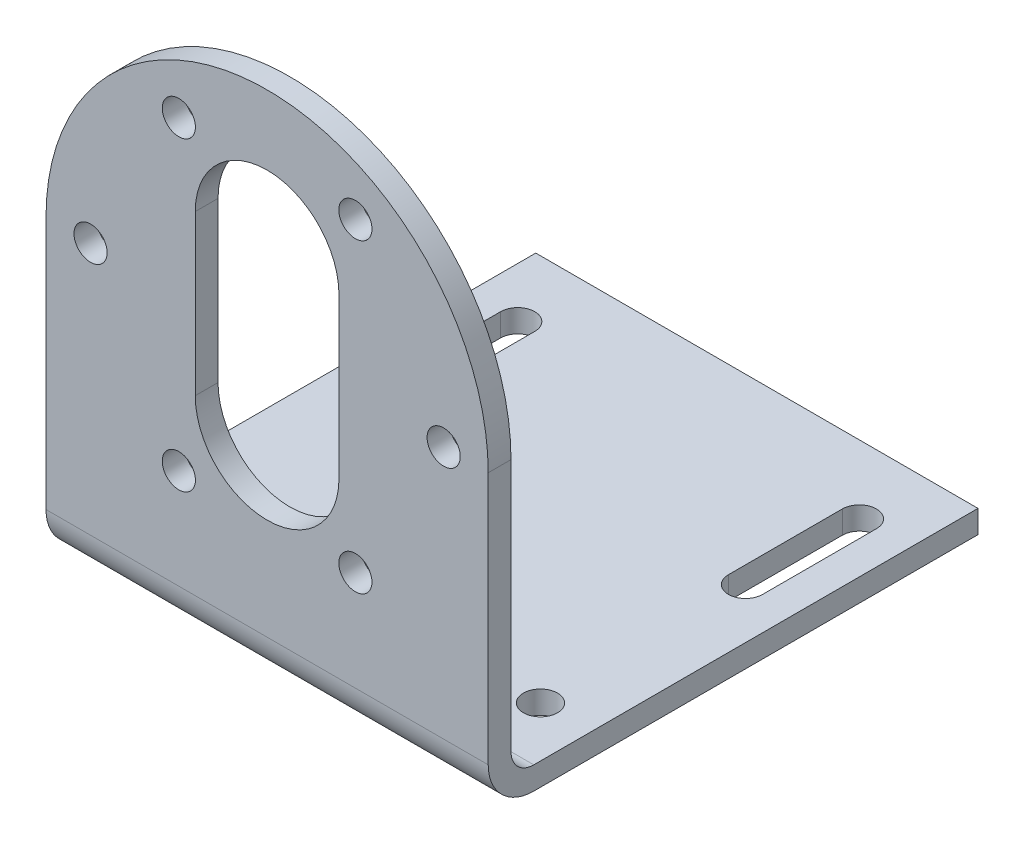
ISO-10303-21;
HEADER;
FILE_DESCRIPTION(('STEP AP214'),'2;1');
FILE_NAME('part.step','',(''),(''),'','','');
FILE_SCHEMA(('AUTOMOTIVE_DESIGN { 1 0 10303 214 1 1 1 1 }'));
ENDSEC;
DATA;
#1=APPLICATION_CONTEXT('core data for automotive mechanical design processes');
#2=APPLICATION_PROTOCOL_DEFINITION('international standard','automotive_design',2000,#1);
#3=PRODUCT_CONTEXT('',#1,'mechanical');
#4=PRODUCT('Part','Part','',(#3));
#5=PRODUCT_RELATED_PRODUCT_CATEGORY('part','',(#4));
#6=PRODUCT_DEFINITION_FORMATION('','',#4);
#7=PRODUCT_DEFINITION_CONTEXT('part definition',#1,'design');
#8=PRODUCT_DEFINITION('design','',#6,#7);
#9=PRODUCT_DEFINITION_SHAPE('','',#8);
#10=(LENGTH_UNIT() NAMED_UNIT(*) SI_UNIT(.MILLI.,.METRE.));
#11=(NAMED_UNIT(*) PLANE_ANGLE_UNIT() SI_UNIT($,.RADIAN.));
#12=(NAMED_UNIT(*) SI_UNIT($,.STERADIAN.) SOLID_ANGLE_UNIT());
#13=UNCERTAINTY_MEASURE_WITH_UNIT(LENGTH_MEASURE(1.E-05),#10,'distance_accuracy_value','');
#14=(GEOMETRIC_REPRESENTATION_CONTEXT(3) GLOBAL_UNCERTAINTY_ASSIGNED_CONTEXT((#13)) GLOBAL_UNIT_ASSIGNED_CONTEXT((#10,
#11,#12)) REPRESENTATION_CONTEXT('',''));
#15=CARTESIAN_POINT('',(0.,0.,0.));
#16=DIRECTION('',(0.,0.,1.));
#17=DIRECTION('',(1.,0.,0.));
#18=AXIS2_PLACEMENT_3D('',#15,#16,#17);
#19=CARTESIAN_POINT('',(0.,26.2069805339947,2.));
#20=DIRECTION('',(0.,0.,1.));
#21=DIRECTION('',(1.,0.,0.));
#22=AXIS2_PLACEMENT_3D('',#19,#20,#21);
#23=PLANE('',#22);
#24=DIRECTION('',(0.,-1.,0.));
#25=VECTOR('',#24,1.);
#26=CARTESIAN_POINT('',(-19.4125781733294,26.2069805339947,2.));
#27=LINE('',#26,#25);
#28=CARTESIAN_POINT('',(-19.4125781733294,26.2069805339947,2.));
#29=VERTEX_POINT('',#28);
#30=CARTESIAN_POINT('',(-19.4125781733294,4.00000000000001,2.));
#31=VERTEX_POINT('',#30);
#32=EDGE_CURVE('E342',#29,#31,#27,.T.);
#33=ORIENTED_EDGE('',*,*,#32,.T.);
#34=DIRECTION('',(1.,0.,0.));
#35=VECTOR('',#34,1.);
#36=CARTESIAN_POINT('',(19.4125781733294,4.,2.));
#37=LINE('',#36,#35);
#38=CARTESIAN_POINT('',(19.4125781733294,4.00000000000001,2.));
#39=VERTEX_POINT('',#38);
#40=EDGE_CURVE('E363',#31,#39,#37,.T.);
#41=ORIENTED_EDGE('',*,*,#40,.T.);
#42=DIRECTION('',(0.,1.,0.));
#43=VECTOR('',#42,1.);
#44=CARTESIAN_POINT('',(19.4125781733294,26.2069805339947,2.));
#45=LINE('',#44,#43);
#46=CARTESIAN_POINT('',(19.4125781733294,26.2069805339947,2.));
#47=VERTEX_POINT('',#46);
#48=EDGE_CURVE('E346',#39,#47,#45,.T.);
#49=ORIENTED_EDGE('',*,*,#48,.T.);
#50=CARTESIAN_POINT('',(0.,26.2069805339947,2.));
#51=DIRECTION('',(0.,0.,1.));
#52=DIRECTION('',(1.,0.,0.));
#53=AXIS2_PLACEMENT_3D('',#50,#51,#52);
#54=CIRCLE('',#53,19.4125781733294);
#55=EDGE_CURVE('E339',#47,#29,#54,.T.);
#56=ORIENTED_EDGE('',*,*,#55,.T.);
#57=EDGE_LOOP('',(#33,#41,#49,#56));
#58=FACE_BOUND('',#57,.T.);
#59=CARTESIAN_POINT('',(-7.75,39.6303742926535,2.));
#60=DIRECTION('',(0.,0.,1.));
#61=DIRECTION('',(1.,0.,0.));
#62=AXIS2_PLACEMENT_3D('',#59,#60,#61);
#63=CIRCLE('',#62,1.45594336299971);
#64=CARTESIAN_POINT('',(-6.2940566370003,39.6303742926535,2.));
#65=VERTEX_POINT('',#64);
#66=EDGE_CURVE('E309',#65,#65,#63,.T.);
#67=ORIENTED_EDGE('',*,*,#66,.F.);
#68=EDGE_LOOP('',(#67));
#69=FACE_BOUND('',#68,.T.);
#70=CARTESIAN_POINT('',(-7.75,12.7835867753359,2.));
#71=DIRECTION('',(0.,0.,1.));
#72=DIRECTION('',(1.,0.,0.));
#73=AXIS2_PLACEMENT_3D('',#70,#71,#72);
#74=CIRCLE('',#73,1.45594336299971);
#75=CARTESIAN_POINT('',(-6.29405663700029,12.7835867753359,2.));
#76=VERTEX_POINT('',#75);
#77=EDGE_CURVE('E321',#76,#76,#74,.T.);
#78=ORIENTED_EDGE('',*,*,#77,.F.);
#79=EDGE_LOOP('',(#78));
#80=FACE_BOUND('',#79,.T.);
#81=CARTESIAN_POINT('',(15.5,26.2069805339947,2.));
#82=DIRECTION('',(0.,0.,1.));
#83=DIRECTION('',(1.,0.,0.));
#84=AXIS2_PLACEMENT_3D('',#81,#82,#83);
#85=CIRCLE('',#84,1.4559433629997);
#86=CARTESIAN_POINT('',(16.9559433629997,26.2069805339947,2.));
#87=VERTEX_POINT('',#86);
#88=EDGE_CURVE('E333',#87,#87,#85,.T.);
#89=ORIENTED_EDGE('',*,*,#88,.F.);
#90=EDGE_LOOP('',(#89));
#91=FACE_BOUND('',#90,.T.);
#92=CARTESIAN_POINT('',(7.75,12.7835867753359,2.));
#93=DIRECTION('',(0.,0.,1.));
#94=DIRECTION('',(1.,0.,0.));
#95=AXIS2_PLACEMENT_3D('',#92,#93,#94);
#96=CIRCLE('',#95,1.45594336299971);
#97=CARTESIAN_POINT('',(9.2059433629997,12.7835867753359,2.));
#98=VERTEX_POINT('',#97);
#99=EDGE_CURVE('E327',#98,#98,#96,.T.);
#100=ORIENTED_EDGE('',*,*,#99,.F.);
#101=EDGE_LOOP('',(#100));
#102=FACE_BOUND('',#101,.T.);
#103=CARTESIAN_POINT('',(-15.5,26.2069805339947,2.));
#104=DIRECTION('',(0.,0.,1.));
#105=DIRECTION('',(1.,0.,0.));
#106=AXIS2_PLACEMENT_3D('',#103,#104,#105);
#107=CIRCLE('',#106,1.4559433629997);
#108=CARTESIAN_POINT('',(-14.0440566370003,26.2069805339947,2.));
#109=VERTEX_POINT('',#108);
#110=EDGE_CURVE('E315',#109,#109,#107,.T.);
#111=ORIENTED_EDGE('',*,*,#110,.F.);
#112=EDGE_LOOP('',(#111));
#113=FACE_BOUND('',#112,.T.);
#114=CARTESIAN_POINT('',(7.75,39.6303742926535,2.));
#115=DIRECTION('',(0.,0.,1.));
#116=DIRECTION('',(1.,0.,0.));
#117=AXIS2_PLACEMENT_3D('',#114,#115,#116);
#118=CIRCLE('',#117,1.4559433629997);
#119=CARTESIAN_POINT('',(9.2059433629997,39.6303742926535,2.));
#120=VERTEX_POINT('',#119);
#121=EDGE_CURVE('E303',#120,#120,#118,.T.);
#122=ORIENTED_EDGE('',*,*,#121,.F.);
#123=EDGE_LOOP('',(#122));
#124=FACE_BOUND('',#123,.T.);
#125=DIRECTION('',(0.,-1.,0.));
#126=VECTOR('',#125,1.);
#127=CARTESIAN_POINT('',(-6.30908790633205,33.2069805339947,2.));
#128=LINE('',#127,#126);
#129=CARTESIAN_POINT('',(-6.30908790633205,33.2069805339947,2.));
#130=VERTEX_POINT('',#129);
#131=CARTESIAN_POINT('',(-6.30908790633205,19.2069805339947,2.));
#132=VERTEX_POINT('',#131);
#133=EDGE_CURVE('E274',#130,#132,#128,.T.);
#134=ORIENTED_EDGE('',*,*,#133,.F.);
#135=CARTESIAN_POINT('',(0.,33.2069805339947,2.));
#136=DIRECTION('',(0.,0.,1.));
#137=DIRECTION('',(1.,0.,0.));
#138=AXIS2_PLACEMENT_3D('',#135,#136,#137);
#139=CIRCLE('',#138,6.30908790633205);
#140=CARTESIAN_POINT('',(6.30908790633205,33.2069805339947,2.));
#141=VERTEX_POINT('',#140);
#142=EDGE_CURVE('E272',#141,#130,#139,.T.);
#143=ORIENTED_EDGE('',*,*,#142,.F.);
#144=DIRECTION('',(0.,1.,0.));
#145=VECTOR('',#144,1.);
#146=CARTESIAN_POINT('',(6.30908790633205,33.2069805339947,2.));
#147=LINE('',#146,#145);
#148=CARTESIAN_POINT('',(6.30908790633205,19.2069805339947,2.));
#149=VERTEX_POINT('',#148);
#150=EDGE_CURVE('E280',#149,#141,#147,.T.);
#151=ORIENTED_EDGE('',*,*,#150,.F.);
#152=CARTESIAN_POINT('',(0.,19.2069805339947,2.));
#153=DIRECTION('',(0.,0.,1.));
#154=DIRECTION('',(1.,0.,0.));
#155=AXIS2_PLACEMENT_3D('',#152,#153,#154);
#156=CIRCLE('',#155,6.30908790633205);
#157=EDGE_CURVE('E277',#132,#149,#156,.T.);
#158=ORIENTED_EDGE('',*,*,#157,.F.);
#159=EDGE_LOOP('',(#134,#143,#151,#158));
#160=FACE_BOUND('',#159,.T.);
#161=ADVANCED_FACE('F34',(#58,#69,#80,#91,#102,#113,#124,#160),#23,.T.);
#162=CARTESIAN_POINT('',(0.,26.2069805339947,0.));
#163=DIRECTION('',(0.,0.,1.));
#164=DIRECTION('',(1.,0.,0.));
#165=AXIS2_PLACEMENT_3D('',#162,#163,#164);
#166=PLANE('',#165);
#167=CARTESIAN_POINT('',(7.75,39.6303742926535,0.));
#168=DIRECTION('',(0.,0.,1.));
#169=DIRECTION('',(1.,0.,0.));
#170=AXIS2_PLACEMENT_3D('',#167,#168,#169);
#171=CIRCLE('',#170,1.4559433629997);
#172=CARTESIAN_POINT('',(9.2059433629997,39.6303742926535,0.));
#173=VERTEX_POINT('',#172);
#174=EDGE_CURVE('E302',#173,#173,#171,.T.);
#175=ORIENTED_EDGE('',*,*,#174,.T.);
#176=EDGE_LOOP('',(#175));
#177=FACE_BOUND('',#176,.T.);
#178=CARTESIAN_POINT('',(-7.75,39.6303742926535,0.));
#179=DIRECTION('',(0.,0.,1.));
#180=DIRECTION('',(1.,0.,0.));
#181=AXIS2_PLACEMENT_3D('',#178,#179,#180);
#182=CIRCLE('',#181,1.45594336299971);
#183=CARTESIAN_POINT('',(-6.2940566370003,39.6303742926535,0.));
#184=VERTEX_POINT('',#183);
#185=EDGE_CURVE('E306',#184,#184,#182,.T.);
#186=ORIENTED_EDGE('',*,*,#185,.T.);
#187=EDGE_LOOP('',(#186));
#188=FACE_BOUND('',#187,.T.);
#189=CARTESIAN_POINT('',(-15.5,26.2069805339947,0.));
#190=DIRECTION('',(0.,0.,1.));
#191=DIRECTION('',(1.,0.,0.));
#192=AXIS2_PLACEMENT_3D('',#189,#190,#191);
#193=CIRCLE('',#192,1.4559433629997);
#194=CARTESIAN_POINT('',(-14.0440566370003,26.2069805339947,0.));
#195=VERTEX_POINT('',#194);
#196=EDGE_CURVE('E312',#195,#195,#193,.T.);
#197=ORIENTED_EDGE('',*,*,#196,.T.);
#198=EDGE_LOOP('',(#197));
#199=FACE_BOUND('',#198,.T.);
#200=CARTESIAN_POINT('',(-7.75,12.7835867753359,0.));
#201=DIRECTION('',(0.,0.,1.));
#202=DIRECTION('',(1.,0.,0.));
#203=AXIS2_PLACEMENT_3D('',#200,#201,#202);
#204=CIRCLE('',#203,1.45594336299971);
#205=CARTESIAN_POINT('',(-6.29405663700029,12.7835867753359,0.));
#206=VERTEX_POINT('',#205);
#207=EDGE_CURVE('E318',#206,#206,#204,.T.);
#208=ORIENTED_EDGE('',*,*,#207,.T.);
#209=EDGE_LOOP('',(#208));
#210=FACE_BOUND('',#209,.T.);
#211=CARTESIAN_POINT('',(7.75,12.7835867753359,0.));
#212=DIRECTION('',(0.,0.,1.));
#213=DIRECTION('',(1.,0.,0.));
#214=AXIS2_PLACEMENT_3D('',#211,#212,#213);
#215=CIRCLE('',#214,1.45594336299971);
#216=CARTESIAN_POINT('',(9.2059433629997,12.7835867753359,0.));
#217=VERTEX_POINT('',#216);
#218=EDGE_CURVE('E324',#217,#217,#215,.T.);
#219=ORIENTED_EDGE('',*,*,#218,.T.);
#220=EDGE_LOOP('',(#219));
#221=FACE_BOUND('',#220,.T.);
#222=CARTESIAN_POINT('',(15.5,26.2069805339947,0.));
#223=DIRECTION('',(0.,0.,1.));
#224=DIRECTION('',(1.,0.,0.));
#225=AXIS2_PLACEMENT_3D('',#222,#223,#224);
#226=CIRCLE('',#225,1.4559433629997);
#227=CARTESIAN_POINT('',(16.9559433629997,26.2069805339947,0.));
#228=VERTEX_POINT('',#227);
#229=EDGE_CURVE('E330',#228,#228,#226,.T.);
#230=ORIENTED_EDGE('',*,*,#229,.T.);
#231=EDGE_LOOP('',(#230));
#232=FACE_BOUND('',#231,.T.);
#233=DIRECTION('',(0.,1.,0.));
#234=VECTOR('',#233,1.);
#235=CARTESIAN_POINT('',(19.4125781733294,26.2069805339947,0.));
#236=LINE('',#235,#234);
#237=CARTESIAN_POINT('',(19.4125781733294,4.00000000000001,0.));
#238=VERTEX_POINT('',#237);
#239=CARTESIAN_POINT('',(19.4125781733294,26.2069805339947,0.));
#240=VERTEX_POINT('',#239);
#241=EDGE_CURVE('E343',#238,#240,#236,.T.);
#242=ORIENTED_EDGE('',*,*,#241,.F.);
#243=DIRECTION('',(-1.,0.,0.));
#244=VECTOR('',#243,1.);
#245=CARTESIAN_POINT('',(0.,4.,0.));
#246=LINE('',#245,#244);
#247=CARTESIAN_POINT('',(-19.4125781733294,4.00000000000001,0.));
#248=VERTEX_POINT('',#247);
#249=EDGE_CURVE('E372',#238,#248,#246,.T.);
#250=ORIENTED_EDGE('',*,*,#249,.T.);
#251=DIRECTION('',(0.,-1.,0.));
#252=VECTOR('',#251,1.);
#253=CARTESIAN_POINT('',(-19.4125781733294,26.2069805339947,0.));
#254=LINE('',#253,#252);
#255=CARTESIAN_POINT('',(-19.4125781733294,26.2069805339947,0.));
#256=VERTEX_POINT('',#255);
#257=EDGE_CURVE('E351',#256,#248,#254,.T.);
#258=ORIENTED_EDGE('',*,*,#257,.F.);
#259=CARTESIAN_POINT('',(0.,26.2069805339947,0.));
#260=DIRECTION('',(0.,0.,1.));
#261=DIRECTION('',(1.,0.,0.));
#262=AXIS2_PLACEMENT_3D('',#259,#260,#261);
#263=CIRCLE('',#262,19.4125781733294);
#264=EDGE_CURVE('E336',#240,#256,#263,.T.);
#265=ORIENTED_EDGE('',*,*,#264,.F.);
#266=EDGE_LOOP('',(#242,#250,#258,#265));
#267=FACE_BOUND('',#266,.T.);
#268=CARTESIAN_POINT('',(0.,33.2069805339947,0.));
#269=DIRECTION('',(0.,0.,1.));
#270=DIRECTION('',(1.,0.,0.));
#271=AXIS2_PLACEMENT_3D('',#268,#269,#270);
#272=CIRCLE('',#271,6.30908790633205);
#273=CARTESIAN_POINT('',(6.30908790633205,33.2069805339947,0.));
#274=VERTEX_POINT('',#273);
#275=CARTESIAN_POINT('',(-6.30908790633205,33.2069805339947,0.));
#276=VERTEX_POINT('',#275);
#277=EDGE_CURVE('E270',#274,#276,#272,.T.);
#278=ORIENTED_EDGE('',*,*,#277,.T.);
#279=DIRECTION('',(0.,-1.,0.));
#280=VECTOR('',#279,1.);
#281=CARTESIAN_POINT('',(-6.30908790633205,33.2069805339947,0.));
#282=LINE('',#281,#280);
#283=CARTESIAN_POINT('',(-6.30908790633205,19.2069805339947,0.));
#284=VERTEX_POINT('',#283);
#285=EDGE_CURVE('E285',#276,#284,#282,.T.);
#286=ORIENTED_EDGE('',*,*,#285,.T.);
#287=CARTESIAN_POINT('',(0.,19.2069805339947,0.));
#288=DIRECTION('',(0.,0.,1.));
#289=DIRECTION('',(1.,0.,0.));
#290=AXIS2_PLACEMENT_3D('',#287,#288,#289);
#291=CIRCLE('',#290,6.30908790633205);
#292=CARTESIAN_POINT('',(6.30908790633205,19.2069805339947,0.));
#293=VERTEX_POINT('',#292);
#294=EDGE_CURVE('E288',#284,#293,#291,.T.);
#295=ORIENTED_EDGE('',*,*,#294,.T.);
#296=DIRECTION('',(0.,1.,0.));
#297=VECTOR('',#296,1.);
#298=CARTESIAN_POINT('',(6.30908790633205,33.2069805339947,0.));
#299=LINE('',#298,#297);
#300=EDGE_CURVE('E275',#293,#274,#299,.T.);
#301=ORIENTED_EDGE('',*,*,#300,.T.);
#302=EDGE_LOOP('',(#278,#286,#295,#301));
#303=FACE_BOUND('',#302,.T.);
#304=ADVANCED_FACE('F378',(#177,#188,#199,#210,#221,#232,#267,#303),#166,.F.);
#305=CARTESIAN_POINT('',(0.,26.2069805339947,2.));
#306=DIRECTION('',(0.,0.,-1.));
#307=DIRECTION('',(-1.,0.,0.));
#308=AXIS2_PLACEMENT_3D('',#305,#306,#307);
#309=CYLINDRICAL_SURFACE('',#308,19.4125781733294);
#310=ORIENTED_EDGE('',*,*,#264,.T.);
#311=DIRECTION('',(0.,0.,-1.));
#312=VECTOR('',#311,1.);
#313=CARTESIAN_POINT('',(-19.4125781733294,26.2069805339947,2.));
#314=LINE('',#313,#312);
#315=EDGE_CURVE('E360',#29,#256,#314,.T.);
#316=ORIENTED_EDGE('',*,*,#315,.F.);
#317=ORIENTED_EDGE('',*,*,#55,.F.);
#318=DIRECTION('',(0.,0.,-1.));
#319=VECTOR('',#318,1.);
#320=CARTESIAN_POINT('',(19.4125781733294,26.2069805339947,2.));
#321=LINE('',#320,#319);
#322=EDGE_CURVE('E348',#47,#240,#321,.T.);
#323=ORIENTED_EDGE('',*,*,#322,.T.);
#324=EDGE_LOOP('',(#310,#316,#317,#323));
#325=FACE_BOUND('',#324,.T.);
#326=ADVANCED_FACE('F388',(#325),#309,.T.);
#327=CARTESIAN_POINT('',(-19.4125781733294,26.2069805339947,2.));
#328=DIRECTION('',(1.,0.,0.));
#329=DIRECTION('',(0.,0.,-1.));
#330=AXIS2_PLACEMENT_3D('',#327,#328,#329);
#331=PLANE('',#330);
#332=DIRECTION('',(0.,0.,-1.));
#333=VECTOR('',#332,1.);
#334=CARTESIAN_POINT('',(-19.4125781733294,0.,2.));
#335=LINE('',#334,#333);
#336=CARTESIAN_POINT('',(-19.4125781733294,0.,-2.));
#337=VERTEX_POINT('',#336);
#338=CARTESIAN_POINT('',(-19.4125781733294,0.,-41.));
#339=VERTEX_POINT('',#338);
#340=EDGE_CURVE('E358',#337,#339,#335,.T.);
#341=ORIENTED_EDGE('',*,*,#340,.F.);
#342=CARTESIAN_POINT('',(-19.4125781733294,4.,-2.));
#343=DIRECTION('',(1.,0.,0.));
#344=DIRECTION('',(0.,0.,-1.));
#345=AXIS2_PLACEMENT_3D('',#342,#343,#344);
#346=CIRCLE('',#345,4.);
#347=EDGE_CURVE('E370',#337,#31,#346,.F.);
#348=ORIENTED_EDGE('',*,*,#347,.T.);
#349=ORIENTED_EDGE('',*,*,#32,.F.);
#350=ORIENTED_EDGE('',*,*,#315,.T.);
#351=ORIENTED_EDGE('',*,*,#257,.T.);
#352=CARTESIAN_POINT('',(-19.4125781733294,4.,-2.));
#353=DIRECTION('',(1.,0.,0.));
#354=DIRECTION('',(0.,0.,-1.));
#355=AXIS2_PLACEMENT_3D('',#352,#353,#354);
#356=CIRCLE('',#355,2.);
#357=CARTESIAN_POINT('',(-19.4125781733294,2.,-2.));
#358=VERTEX_POINT('',#357);
#359=EDGE_CURVE('E42',#248,#358,#356,.T.);
#360=ORIENTED_EDGE('',*,*,#359,.T.);
#361=DIRECTION('',(0.,0.,1.));
#362=VECTOR('',#361,1.);
#363=CARTESIAN_POINT('',(-19.4125781733294,2.,-41.));
#364=LINE('',#363,#362);
#365=CARTESIAN_POINT('',(-19.4125781733294,2.,-41.));
#366=VERTEX_POINT('',#365);
#367=EDGE_CURVE('E268',#366,#358,#364,.T.);
#368=ORIENTED_EDGE('',*,*,#367,.F.);
#369=DIRECTION('',(0.,-1.,0.));
#370=VECTOR('',#369,1.);
#371=CARTESIAN_POINT('',(-19.4125781733294,0.,-41.));
#372=LINE('',#371,#370);
#373=EDGE_CURVE('E255',#366,#339,#372,.T.);
#374=ORIENTED_EDGE('',*,*,#373,.T.);
#375=EDGE_LOOP('',(#341,#348,#349,#350,#351,#360,#368,#374));
#376=FACE_BOUND('',#375,.T.);
#377=ADVANCED_FACE('F384',(#376),#331,.F.);
#378=CARTESIAN_POINT('',(-19.4125781733294,0.,2.));
#379=DIRECTION('',(0.,1.,0.));
#380=DIRECTION('',(0.,0.,1.));
#381=AXIS2_PLACEMENT_3D('',#378,#379,#380);
#382=PLANE('',#381);
#383=CARTESIAN_POINT('',(15.,0.,-7.));
#384=DIRECTION('',(0.,1.,0.));
#385=DIRECTION('',(0.,0.,1.));
#386=AXIS2_PLACEMENT_3D('',#383,#384,#385);
#387=CIRCLE('',#386,1.5);
#388=CARTESIAN_POINT('',(15.,0.,-5.5));
#389=VERTEX_POINT('',#388);
#390=EDGE_CURVE('E246',#389,#389,#387,.T.);
#391=ORIENTED_EDGE('',*,*,#390,.T.);
#392=EDGE_LOOP('',(#391));
#393=FACE_BOUND('',#392,.T.);
#394=DIRECTION('',(0.,0.,-1.));
#395=VECTOR('',#394,1.);
#396=CARTESIAN_POINT('',(-13.5,0.,1.99999999999999));
#397=LINE('',#396,#395);
#398=CARTESIAN_POINT('',(-13.5000000000001,0.,-25.));
#399=VERTEX_POINT('',#398);
#400=CARTESIAN_POINT('',(-13.5000000000001,0.,-35.));
#401=VERTEX_POINT('',#400);
#402=EDGE_CURVE('E240',#399,#401,#397,.T.);
#403=ORIENTED_EDGE('',*,*,#402,.T.);
#404=CARTESIAN_POINT('',(-15.0000000000001,0.,-35.));
#405=DIRECTION('',(0.,1.,0.));
#406=DIRECTION('',(0.,0.,1.));
#407=AXIS2_PLACEMENT_3D('',#404,#405,#406);
#408=CIRCLE('',#407,1.5);
#409=CARTESIAN_POINT('',(-16.5000000000001,0.,-35.));
#410=VERTEX_POINT('',#409);
#411=EDGE_CURVE('E243',#401,#410,#408,.T.);
#412=ORIENTED_EDGE('',*,*,#411,.T.);
#413=DIRECTION('',(0.,0.,1.));
#414=VECTOR('',#413,1.);
#415=CARTESIAN_POINT('',(-16.5,0.,2.));
#416=LINE('',#415,#414);
#417=CARTESIAN_POINT('',(-16.5000000000001,0.,-25.));
#418=VERTEX_POINT('',#417);
#419=EDGE_CURVE('E237',#410,#418,#416,.T.);
#420=ORIENTED_EDGE('',*,*,#419,.T.);
#421=CARTESIAN_POINT('',(-15.0000000000001,0.,-25.));
#422=DIRECTION('',(0.,1.,0.));
#423=DIRECTION('',(0.,0.,1.));
#424=AXIS2_PLACEMENT_3D('',#421,#422,#423);
#425=CIRCLE('',#424,1.5);
#426=EDGE_CURVE('E177',#418,#399,#425,.T.);
#427=ORIENTED_EDGE('',*,*,#426,.T.);
#428=EDGE_LOOP('',(#403,#412,#420,#427));
#429=FACE_BOUND('',#428,.T.);
#430=DIRECTION('',(0.,0.,-1.));
#431=VECTOR('',#430,1.);
#432=CARTESIAN_POINT('',(16.5,0.,1.99999999999994));
#433=LINE('',#432,#431);
#434=CARTESIAN_POINT('',(16.4999999999999,0.,-25.));
#435=VERTEX_POINT('',#434);
#436=CARTESIAN_POINT('',(16.4999999999999,0.,-35.));
#437=VERTEX_POINT('',#436);
#438=EDGE_CURVE('E231',#435,#437,#433,.T.);
#439=ORIENTED_EDGE('',*,*,#438,.T.);
#440=CARTESIAN_POINT('',(14.9999999999999,0.,-35.));
#441=DIRECTION('',(0.,1.,0.));
#442=DIRECTION('',(0.,0.,1.));
#443=AXIS2_PLACEMENT_3D('',#440,#441,#442);
#444=CIRCLE('',#443,1.5);
#445=CARTESIAN_POINT('',(13.4999999999999,0.,-35.));
#446=VERTEX_POINT('',#445);
#447=EDGE_CURVE('E234',#437,#446,#444,.T.);
#448=ORIENTED_EDGE('',*,*,#447,.T.);
#449=DIRECTION('',(0.,0.,1.));
#450=VECTOR('',#449,1.);
#451=CARTESIAN_POINT('',(13.5,0.,1.99999999999995));
#452=LINE('',#451,#450);
#453=CARTESIAN_POINT('',(13.4999999999999,0.,-25.));
#454=VERTEX_POINT('',#453);
#455=EDGE_CURVE('E225',#446,#454,#452,.T.);
#456=ORIENTED_EDGE('',*,*,#455,.T.);
#457=CARTESIAN_POINT('',(14.9999999999999,0.,-25.));
#458=DIRECTION('',(0.,1.,0.));
#459=DIRECTION('',(0.,0.,1.));
#460=AXIS2_PLACEMENT_3D('',#457,#458,#459);
#461=CIRCLE('',#460,1.5);
#462=EDGE_CURVE('E228',#454,#435,#461,.T.);
#463=ORIENTED_EDGE('',*,*,#462,.T.);
#464=EDGE_LOOP('',(#439,#448,#456,#463));
#465=FACE_BOUND('',#464,.T.);
#466=CARTESIAN_POINT('',(-15.,0.,-7.));
#467=DIRECTION('',(0.,1.,0.));
#468=DIRECTION('',(0.,0.,1.));
#469=AXIS2_PLACEMENT_3D('',#466,#467,#468);
#470=CIRCLE('',#469,1.5);
#471=CARTESIAN_POINT('',(-15.,0.,-5.5));
#472=VERTEX_POINT('',#471);
#473=EDGE_CURVE('E252',#472,#472,#470,.T.);
#474=ORIENTED_EDGE('',*,*,#473,.T.);
#475=EDGE_LOOP('',(#474));
#476=FACE_BOUND('',#475,.T.);
#477=DIRECTION('',(0.,0.,-1.));
#478=VECTOR('',#477,1.);
#479=CARTESIAN_POINT('',(19.4125781733294,0.,2.));
#480=LINE('',#479,#478);
#481=CARTESIAN_POINT('',(19.4125781733294,0.,-2.));
#482=VERTEX_POINT('',#481);
#483=CARTESIAN_POINT('',(19.4125781733294,0.,-41.));
#484=VERTEX_POINT('',#483);
#485=EDGE_CURVE('E356',#482,#484,#480,.T.);
#486=ORIENTED_EDGE('',*,*,#485,.F.);
#487=DIRECTION('',(1.,0.,0.));
#488=VECTOR('',#487,1.);
#489=CARTESIAN_POINT('',(-19.4125781733294,0.,-2.));
#490=LINE('',#489,#488);
#491=EDGE_CURVE('E368',#482,#337,#490,.F.);
#492=ORIENTED_EDGE('',*,*,#491,.T.);
#493=ORIENTED_EDGE('',*,*,#340,.T.);
#494=DIRECTION('',(1.,0.,0.));
#495=VECTOR('',#494,1.);
#496=CARTESIAN_POINT('',(-19.4125781733294,0.,-41.));
#497=LINE('',#496,#495);
#498=EDGE_CURVE('E258',#339,#484,#497,.T.);
#499=ORIENTED_EDGE('',*,*,#498,.T.);
#500=EDGE_LOOP('',(#486,#492,#493,#499));
#501=FACE_BOUND('',#500,.T.);
#502=ADVANCED_FACE('F415',(#393,#429,#465,#476,#501),#382,.F.);
#503=CARTESIAN_POINT('',(19.4125781733294,26.2069805339947,2.));
#504=DIRECTION('',(-1.,0.,0.));
#505=DIRECTION('',(0.,0.,1.));
#506=AXIS2_PLACEMENT_3D('',#503,#504,#505);
#507=PLANE('',#506);
#508=ORIENTED_EDGE('',*,*,#48,.F.);
#509=CARTESIAN_POINT('',(19.4125781733294,4.,-2.));
#510=DIRECTION('',(-1.,0.,0.));
#511=DIRECTION('',(0.,0.,1.));
#512=AXIS2_PLACEMENT_3D('',#509,#510,#511);
#513=CIRCLE('',#512,4.);
#514=EDGE_CURVE('E366',#39,#482,#513,.F.);
#515=ORIENTED_EDGE('',*,*,#514,.T.);
#516=ORIENTED_EDGE('',*,*,#485,.T.);
#517=DIRECTION('',(0.,1.,0.));
#518=VECTOR('',#517,1.);
#519=CARTESIAN_POINT('',(19.4125781733294,0.,-41.));
#520=LINE('',#519,#518);
#521=CARTESIAN_POINT('',(19.4125781733294,2.,-41.));
#522=VERTEX_POINT('',#521);
#523=EDGE_CURVE('E261',#484,#522,#520,.T.);
#524=ORIENTED_EDGE('',*,*,#523,.T.);
#525=DIRECTION('',(0.,0.,1.));
#526=VECTOR('',#525,1.);
#527=CARTESIAN_POINT('',(19.4125781733294,2.,-41.));
#528=LINE('',#527,#526);
#529=CARTESIAN_POINT('',(19.4125781733294,2.,-2.));
#530=VERTEX_POINT('',#529);
#531=EDGE_CURVE('E267',#522,#530,#528,.T.);
#532=ORIENTED_EDGE('',*,*,#531,.T.);
#533=CARTESIAN_POINT('',(19.4125781733294,4.,-2.));
#534=DIRECTION('',(-1.,0.,0.));
#535=DIRECTION('',(0.,0.,1.));
#536=AXIS2_PLACEMENT_3D('',#533,#534,#535);
#537=CIRCLE('',#536,2.);
#538=EDGE_CURVE('E11',#530,#238,#537,.T.);
#539=ORIENTED_EDGE('',*,*,#538,.T.);
#540=ORIENTED_EDGE('',*,*,#241,.T.);
#541=ORIENTED_EDGE('',*,*,#322,.F.);
#542=EDGE_LOOP('',(#508,#515,#516,#524,#532,#539,#540,#541));
#543=FACE_BOUND('',#542,.T.);
#544=ADVANCED_FACE('F392',(#543),#507,.F.);
#545=CARTESIAN_POINT('',(15.5,26.2069805339947,2.));
#546=DIRECTION('',(0.,0.,-1.));
#547=DIRECTION('',(-1.,0.,0.));
#548=AXIS2_PLACEMENT_3D('',#545,#546,#547);
#549=CYLINDRICAL_SURFACE('',#548,1.4559433629997);
#550=ORIENTED_EDGE('',*,*,#88,.T.);
#551=EDGE_LOOP('',(#550));
#552=FACE_BOUND('',#551,.T.);
#553=ORIENTED_EDGE('',*,*,#229,.F.);
#554=EDGE_LOOP('',(#553));
#555=FACE_BOUND('',#554,.T.);
#556=ADVANCED_FACE('F410',(#552,#555),#549,.F.);
#557=CARTESIAN_POINT('',(7.75,12.7835867753359,2.));
#558=DIRECTION('',(0.,0.,-1.));
#559=DIRECTION('',(-1.,0.,0.));
#560=AXIS2_PLACEMENT_3D('',#557,#558,#559);
#561=CYLINDRICAL_SURFACE('',#560,1.45594336299971);
#562=ORIENTED_EDGE('',*,*,#99,.T.);
#563=EDGE_LOOP('',(#562));
#564=FACE_BOUND('',#563,.T.);
#565=ORIENTED_EDGE('',*,*,#218,.F.);
#566=EDGE_LOOP('',(#565));
#567=FACE_BOUND('',#566,.T.);
#568=ADVANCED_FACE('F446',(#564,#567),#561,.F.);
#569=CARTESIAN_POINT('',(-7.75,12.7835867753359,2.));
#570=DIRECTION('',(0.,0.,-1.));
#571=DIRECTION('',(-1.,0.,0.));
#572=AXIS2_PLACEMENT_3D('',#569,#570,#571);
#573=CYLINDRICAL_SURFACE('',#572,1.45594336299971);
#574=ORIENTED_EDGE('',*,*,#77,.T.);
#575=EDGE_LOOP('',(#574));
#576=FACE_BOUND('',#575,.T.);
#577=ORIENTED_EDGE('',*,*,#207,.F.);
#578=EDGE_LOOP('',(#577));
#579=FACE_BOUND('',#578,.T.);
#580=ADVANCED_FACE('F453',(#576,#579),#573,.F.);
#581=CARTESIAN_POINT('',(-15.5,26.2069805339947,2.));
#582=DIRECTION('',(0.,0.,-1.));
#583=DIRECTION('',(-1.,0.,0.));
#584=AXIS2_PLACEMENT_3D('',#581,#582,#583);
#585=CYLINDRICAL_SURFACE('',#584,1.4559433629997);
#586=ORIENTED_EDGE('',*,*,#110,.T.);
#587=EDGE_LOOP('',(#586));
#588=FACE_BOUND('',#587,.T.);
#589=ORIENTED_EDGE('',*,*,#196,.F.);
#590=EDGE_LOOP('',(#589));
#591=FACE_BOUND('',#590,.T.);
#592=ADVANCED_FACE('F460',(#588,#591),#585,.F.);
#593=CARTESIAN_POINT('',(-7.75,39.6303742926535,2.));
#594=DIRECTION('',(0.,0.,-1.));
#595=DIRECTION('',(-1.,0.,0.));
#596=AXIS2_PLACEMENT_3D('',#593,#594,#595);
#597=CYLINDRICAL_SURFACE('',#596,1.45594336299971);
#598=ORIENTED_EDGE('',*,*,#66,.T.);
#599=EDGE_LOOP('',(#598));
#600=FACE_BOUND('',#599,.T.);
#601=ORIENTED_EDGE('',*,*,#185,.F.);
#602=EDGE_LOOP('',(#601));
#603=FACE_BOUND('',#602,.T.);
#604=ADVANCED_FACE('F468',(#600,#603),#597,.F.);
#605=CARTESIAN_POINT('',(7.75,39.6303742926535,2.));
#606=DIRECTION('',(0.,0.,-1.));
#607=DIRECTION('',(-1.,0.,0.));
#608=AXIS2_PLACEMENT_3D('',#605,#606,#607);
#609=CYLINDRICAL_SURFACE('',#608,1.4559433629997);
#610=ORIENTED_EDGE('',*,*,#121,.T.);
#611=EDGE_LOOP('',(#610));
#612=FACE_BOUND('',#611,.T.);
#613=ORIENTED_EDGE('',*,*,#174,.F.);
#614=EDGE_LOOP('',(#613));
#615=FACE_BOUND('',#614,.T.);
#616=ADVANCED_FACE('F476',(#612,#615),#609,.F.);
#617=CARTESIAN_POINT('',(0.,33.2069805339947,2.));
#618=DIRECTION('',(0.,0.,-1.));
#619=DIRECTION('',(-1.,0.,0.));
#620=AXIS2_PLACEMENT_3D('',#617,#618,#619);
#621=CYLINDRICAL_SURFACE('',#620,6.30908790633205);
#622=ORIENTED_EDGE('',*,*,#277,.F.);
#623=DIRECTION('',(0.,0.,-1.));
#624=VECTOR('',#623,1.);
#625=CARTESIAN_POINT('',(6.30908790633205,33.2069805339947,2.));
#626=LINE('',#625,#624);
#627=EDGE_CURVE('E282',#141,#274,#626,.T.);
#628=ORIENTED_EDGE('',*,*,#627,.F.);
#629=ORIENTED_EDGE('',*,*,#142,.T.);
#630=DIRECTION('',(0.,0.,-1.));
#631=VECTOR('',#630,1.);
#632=CARTESIAN_POINT('',(-6.30908790633205,33.2069805339947,2.));
#633=LINE('',#632,#631);
#634=EDGE_CURVE('E299',#130,#276,#633,.T.);
#635=ORIENTED_EDGE('',*,*,#634,.T.);
#636=EDGE_LOOP('',(#622,#628,#629,#635));
#637=FACE_BOUND('',#636,.T.);
#638=ADVANCED_FACE('F484',(#637),#621,.F.);
#639=CARTESIAN_POINT('',(-6.30908790633205,33.2069805339947,2.));
#640=DIRECTION('',(1.,0.,0.));
#641=DIRECTION('',(0.,0.,-1.));
#642=AXIS2_PLACEMENT_3D('',#639,#640,#641);
#643=PLANE('',#642);
#644=ORIENTED_EDGE('',*,*,#285,.F.);
#645=ORIENTED_EDGE('',*,*,#634,.F.);
#646=ORIENTED_EDGE('',*,*,#133,.T.);
#647=DIRECTION('',(0.,0.,-1.));
#648=VECTOR('',#647,1.);
#649=CARTESIAN_POINT('',(-6.30908790633205,19.2069805339947,2.));
#650=LINE('',#649,#648);
#651=EDGE_CURVE('E297',#132,#284,#650,.T.);
#652=ORIENTED_EDGE('',*,*,#651,.T.);
#653=EDGE_LOOP('',(#644,#645,#646,#652));
#654=FACE_BOUND('',#653,.T.);
#655=ADVANCED_FACE('F492',(#654),#643,.T.);
#656=CARTESIAN_POINT('',(0.,19.2069805339947,2.));
#657=DIRECTION('',(0.,0.,-1.));
#658=DIRECTION('',(-1.,0.,0.));
#659=AXIS2_PLACEMENT_3D('',#656,#657,#658);
#660=CYLINDRICAL_SURFACE('',#659,6.30908790633205);
#661=ORIENTED_EDGE('',*,*,#294,.F.);
#662=ORIENTED_EDGE('',*,*,#651,.F.);
#663=ORIENTED_EDGE('',*,*,#157,.T.);
#664=DIRECTION('',(0.,0.,-1.));
#665=VECTOR('',#664,1.);
#666=CARTESIAN_POINT('',(6.30908790633205,19.2069805339947,2.));
#667=LINE('',#666,#665);
#668=EDGE_CURVE('E295',#149,#293,#667,.T.);
#669=ORIENTED_EDGE('',*,*,#668,.T.);
#670=EDGE_LOOP('',(#661,#662,#663,#669));
#671=FACE_BOUND('',#670,.T.);
#672=ADVANCED_FACE('F500',(#671),#660,.F.);
#673=CARTESIAN_POINT('',(6.30908790633205,33.2069805339947,2.));
#674=DIRECTION('',(-1.,0.,0.));
#675=DIRECTION('',(0.,0.,1.));
#676=AXIS2_PLACEMENT_3D('',#673,#674,#675);
#677=PLANE('',#676);
#678=ORIENTED_EDGE('',*,*,#300,.F.);
#679=ORIENTED_EDGE('',*,*,#668,.F.);
#680=ORIENTED_EDGE('',*,*,#150,.T.);
#681=ORIENTED_EDGE('',*,*,#627,.T.);
#682=EDGE_LOOP('',(#678,#679,#680,#681));
#683=FACE_BOUND('',#682,.T.);
#684=ADVANCED_FACE('F508',(#683),#677,.T.);
#685=CARTESIAN_POINT('',(-19.4125781733294,2.,-41.));
#686=DIRECTION('',(0.,1.,0.));
#687=DIRECTION('',(0.,0.,1.));
#688=AXIS2_PLACEMENT_3D('',#685,#686,#687);
#689=PLANE('',#688);
#690=CARTESIAN_POINT('',(15.,2.,-7.));
#691=DIRECTION('',(0.,1.,0.));
#692=DIRECTION('',(0.,0.,1.));
#693=AXIS2_PLACEMENT_3D('',#690,#691,#692);
#694=CIRCLE('',#693,1.5);
#695=CARTESIAN_POINT('',(15.,2.,-5.5));
#696=VERTEX_POINT('',#695);
#697=EDGE_CURVE('E202',#696,#696,#694,.T.);
#698=ORIENTED_EDGE('',*,*,#697,.F.);
#699=EDGE_LOOP('',(#698));
#700=FACE_BOUND('',#699,.T.);
#701=CARTESIAN_POINT('',(-15.0000000000001,2.,-35.));
#702=DIRECTION('',(0.,1.,0.));
#703=DIRECTION('',(0.,0.,1.));
#704=AXIS2_PLACEMENT_3D('',#701,#702,#703);
#705=CIRCLE('',#704,1.5);
#706=CARTESIAN_POINT('',(-13.5000000000001,2.,-35.));
#707=VERTEX_POINT('',#706);
#708=CARTESIAN_POINT('',(-16.5000000000001,2.,-35.));
#709=VERTEX_POINT('',#708);
#710=EDGE_CURVE('E190',#707,#709,#705,.T.);
#711=ORIENTED_EDGE('',*,*,#710,.F.);
#712=DIRECTION('',(0.,0.,-1.));
#713=VECTOR('',#712,1.);
#714=CARTESIAN_POINT('',(-13.5000000000001,2.,-35.));
#715=LINE('',#714,#713);
#716=CARTESIAN_POINT('',(-13.5000000000001,2.,-25.));
#717=VERTEX_POINT('',#716);
#718=EDGE_CURVE('E195',#717,#707,#715,.T.);
#719=ORIENTED_EDGE('',*,*,#718,.F.);
#720=CARTESIAN_POINT('',(-15.0000000000001,2.,-25.));
#721=DIRECTION('',(0.,1.,0.));
#722=DIRECTION('',(0.,0.,1.));
#723=AXIS2_PLACEMENT_3D('',#720,#721,#722);
#724=CIRCLE('',#723,1.5);
#725=CARTESIAN_POINT('',(-16.5000000000001,2.,-25.));
#726=VERTEX_POINT('',#725);
#727=EDGE_CURVE('E174',#726,#717,#724,.T.);
#728=ORIENTED_EDGE('',*,*,#727,.F.);
#729=DIRECTION('',(0.,0.,1.));
#730=VECTOR('',#729,1.);
#731=CARTESIAN_POINT('',(-16.5000000000001,2.,-35.));
#732=LINE('',#731,#730);
#733=EDGE_CURVE('E185',#709,#726,#732,.T.);
#734=ORIENTED_EDGE('',*,*,#733,.F.);
#735=EDGE_LOOP('',(#711,#719,#728,#734));
#736=FACE_BOUND('',#735,.T.);
#737=CARTESIAN_POINT('',(14.9999999999999,2.,-35.));
#738=DIRECTION('',(0.,1.,0.));
#739=DIRECTION('',(0.,0.,1.));
#740=AXIS2_PLACEMENT_3D('',#737,#738,#739);
#741=CIRCLE('',#740,1.5);
#742=CARTESIAN_POINT('',(16.4999999999999,2.,-35.));
#743=VERTEX_POINT('',#742);
#744=CARTESIAN_POINT('',(13.4999999999999,2.,-35.));
#745=VERTEX_POINT('',#744);
#746=EDGE_CURVE('E205',#743,#745,#741,.T.);
#747=ORIENTED_EDGE('',*,*,#746,.F.);
#748=DIRECTION('',(0.,0.,-1.));
#749=VECTOR('',#748,1.);
#750=CARTESIAN_POINT('',(16.4999999999999,2.,-35.));
#751=LINE('',#750,#749);
#752=CARTESIAN_POINT('',(16.4999999999999,2.,-25.));
#753=VERTEX_POINT('',#752);
#754=EDGE_CURVE('E213',#753,#743,#751,.T.);
#755=ORIENTED_EDGE('',*,*,#754,.F.);
#756=CARTESIAN_POINT('',(14.9999999999999,2.,-25.));
#757=DIRECTION('',(0.,1.,0.));
#758=DIRECTION('',(0.,0.,1.));
#759=AXIS2_PLACEMENT_3D('',#756,#757,#758);
#760=CIRCLE('',#759,1.5);
#761=CARTESIAN_POINT('',(13.4999999999999,2.,-25.));
#762=VERTEX_POINT('',#761);
#763=EDGE_CURVE('E210',#762,#753,#760,.T.);
#764=ORIENTED_EDGE('',*,*,#763,.F.);
#765=DIRECTION('',(0.,0.,1.));
#766=VECTOR('',#765,1.);
#767=CARTESIAN_POINT('',(13.4999999999999,2.,-35.));
#768=LINE('',#767,#766);
#769=EDGE_CURVE('E207',#745,#762,#768,.T.);
#770=ORIENTED_EDGE('',*,*,#769,.F.);
#771=EDGE_LOOP('',(#747,#755,#764,#770));
#772=FACE_BOUND('',#771,.T.);
#773=CARTESIAN_POINT('',(-15.,2.,-7.));
#774=DIRECTION('',(0.,1.,0.));
#775=DIRECTION('',(0.,0.,1.));
#776=AXIS2_PLACEMENT_3D('',#773,#774,#775);
#777=CIRCLE('',#776,1.5);
#778=CARTESIAN_POINT('',(-15.,2.,-5.5));
#779=VERTEX_POINT('',#778);
#780=EDGE_CURVE('E249',#779,#779,#777,.T.);
#781=ORIENTED_EDGE('',*,*,#780,.F.);
#782=EDGE_LOOP('',(#781));
#783=FACE_BOUND('',#782,.T.);
#784=ORIENTED_EDGE('',*,*,#367,.T.);
#785=DIRECTION('',(-1.,0.,0.));
#786=VECTOR('',#785,1.);
#787=CARTESIAN_POINT('',(-19.4125781733294,2.,-2.));
#788=LINE('',#787,#786);
#789=EDGE_CURVE('E55',#358,#530,#788,.F.);
#790=ORIENTED_EDGE('',*,*,#789,.T.);
#791=ORIENTED_EDGE('',*,*,#531,.F.);
#792=DIRECTION('',(-1.,0.,0.));
#793=VECTOR('',#792,1.);
#794=CARTESIAN_POINT('',(-19.4125781733294,2.,-41.));
#795=LINE('',#794,#793);
#796=EDGE_CURVE('E264',#522,#366,#795,.T.);
#797=ORIENTED_EDGE('',*,*,#796,.T.);
#798=EDGE_LOOP('',(#784,#790,#791,#797));
#799=FACE_BOUND('',#798,.T.);
#800=ADVANCED_FACE('F192',(#700,#736,#772,#783,#799),#689,.T.);
#801=CARTESIAN_POINT('',(0.,0.,-41.));
#802=DIRECTION('',(0.,0.,-1.));
#803=DIRECTION('',(-1.,0.,0.));
#804=AXIS2_PLACEMENT_3D('',#801,#802,#803);
#805=PLANE('',#804);
#806=ORIENTED_EDGE('',*,*,#373,.F.);
#807=ORIENTED_EDGE('',*,*,#796,.F.);
#808=ORIENTED_EDGE('',*,*,#523,.F.);
#809=ORIENTED_EDGE('',*,*,#498,.F.);
#810=EDGE_LOOP('',(#806,#807,#808,#809));
#811=FACE_BOUND('',#810,.T.);
#812=ADVANCED_FACE('F523',(#811),#805,.T.);
#813=CARTESIAN_POINT('',(-15.,-8.,-7.));
#814=DIRECTION('',(0.,1.,0.));
#815=DIRECTION('',(0.,0.,1.));
#816=AXIS2_PLACEMENT_3D('',#813,#814,#815);
#817=CYLINDRICAL_SURFACE('',#816,1.5);
#818=ORIENTED_EDGE('',*,*,#780,.T.);
#819=EDGE_LOOP('',(#818));
#820=FACE_BOUND('',#819,.T.);
#821=ORIENTED_EDGE('',*,*,#473,.F.);
#822=EDGE_LOOP('',(#821));
#823=FACE_BOUND('',#822,.T.);
#824=ADVANCED_FACE('F530',(#820,#823),#817,.F.);
#825=CARTESIAN_POINT('',(14.9999999999999,-8.,-35.));
#826=DIRECTION('',(0.,1.,0.));
#827=DIRECTION('',(0.,0.,1.));
#828=AXIS2_PLACEMENT_3D('',#825,#826,#827);
#829=CYLINDRICAL_SURFACE('',#828,1.5);
#830=DIRECTION('',(0.,1.,0.));
#831=VECTOR('',#830,1.);
#832=CARTESIAN_POINT('',(16.4999999999999,-8.,-35.));
#833=LINE('',#832,#831);
#834=EDGE_CURVE('E217',#437,#743,#833,.T.);
#835=ORIENTED_EDGE('',*,*,#834,.T.);
#836=ORIENTED_EDGE('',*,*,#746,.T.);
#837=DIRECTION('',(0.,1.,0.));
#838=VECTOR('',#837,1.);
#839=CARTESIAN_POINT('',(13.4999999999999,-8.,-35.));
#840=LINE('',#839,#838);
#841=EDGE_CURVE('E216',#446,#745,#840,.T.);
#842=ORIENTED_EDGE('',*,*,#841,.F.);
#843=ORIENTED_EDGE('',*,*,#447,.F.);
#844=EDGE_LOOP('',(#835,#836,#842,#843));
#845=FACE_BOUND('',#844,.T.);
#846=ADVANCED_FACE('F538',(#845),#829,.F.);
#847=CARTESIAN_POINT('',(16.4999999999999,-8.,-35.));
#848=DIRECTION('',(1.,0.,0.));
#849=DIRECTION('',(0.,0.,-1.));
#850=AXIS2_PLACEMENT_3D('',#847,#848,#849);
#851=PLANE('',#850);
#852=DIRECTION('',(0.,1.,0.));
#853=VECTOR('',#852,1.);
#854=CARTESIAN_POINT('',(16.4999999999999,-8.,-25.));
#855=LINE('',#854,#853);
#856=EDGE_CURVE('E219',#435,#753,#855,.T.);
#857=ORIENTED_EDGE('',*,*,#856,.T.);
#858=ORIENTED_EDGE('',*,*,#754,.T.);
#859=ORIENTED_EDGE('',*,*,#834,.F.);
#860=ORIENTED_EDGE('',*,*,#438,.F.);
#861=EDGE_LOOP('',(#857,#858,#859,#860));
#862=FACE_BOUND('',#861,.T.);
#863=ADVANCED_FACE('F546',(#862),#851,.F.);
#864=CARTESIAN_POINT('',(14.9999999999999,-8.,-25.));
#865=DIRECTION('',(0.,1.,0.));
#866=DIRECTION('',(0.,0.,1.));
#867=AXIS2_PLACEMENT_3D('',#864,#865,#866);
#868=CYLINDRICAL_SURFACE('',#867,1.5);
#869=DIRECTION('',(0.,1.,0.));
#870=VECTOR('',#869,1.);
#871=CARTESIAN_POINT('',(13.4999999999999,-8.,-25.));
#872=LINE('',#871,#870);
#873=EDGE_CURVE('E221',#454,#762,#872,.T.);
#874=ORIENTED_EDGE('',*,*,#873,.T.);
#875=ORIENTED_EDGE('',*,*,#763,.T.);
#876=ORIENTED_EDGE('',*,*,#856,.F.);
#877=ORIENTED_EDGE('',*,*,#462,.F.);
#878=EDGE_LOOP('',(#874,#875,#876,#877));
#879=FACE_BOUND('',#878,.T.);
#880=ADVANCED_FACE('F554',(#879),#868,.F.);
#881=CARTESIAN_POINT('',(13.4999999999999,-8.,-35.));
#882=DIRECTION('',(-1.,0.,0.));
#883=DIRECTION('',(0.,0.,1.));
#884=AXIS2_PLACEMENT_3D('',#881,#882,#883);
#885=PLANE('',#884);
#886=ORIENTED_EDGE('',*,*,#841,.T.);
#887=ORIENTED_EDGE('',*,*,#769,.T.);
#888=ORIENTED_EDGE('',*,*,#873,.F.);
#889=ORIENTED_EDGE('',*,*,#455,.F.);
#890=EDGE_LOOP('',(#886,#887,#888,#889));
#891=FACE_BOUND('',#890,.T.);
#892=ADVANCED_FACE('F562',(#891),#885,.F.);
#893=CARTESIAN_POINT('',(-15.0000000000001,-8.,-35.));
#894=DIRECTION('',(0.,1.,0.));
#895=DIRECTION('',(0.,0.,1.));
#896=AXIS2_PLACEMENT_3D('',#893,#894,#895);
#897=CYLINDRICAL_SURFACE('',#896,1.5);
#898=DIRECTION('',(0.,1.,0.));
#899=VECTOR('',#898,1.);
#900=CARTESIAN_POINT('',(-13.5000000000001,-8.,-35.));
#901=LINE('',#900,#899);
#902=EDGE_CURVE('E200',#401,#707,#901,.T.);
#903=ORIENTED_EDGE('',*,*,#902,.T.);
#904=ORIENTED_EDGE('',*,*,#710,.T.);
#905=DIRECTION('',(0.,1.,0.));
#906=VECTOR('',#905,1.);
#907=CARTESIAN_POINT('',(-16.5000000000001,-8.,-35.));
#908=LINE('',#907,#906);
#909=EDGE_CURVE('E181',#410,#709,#908,.T.);
#910=ORIENTED_EDGE('',*,*,#909,.F.);
#911=ORIENTED_EDGE('',*,*,#411,.F.);
#912=EDGE_LOOP('',(#903,#904,#910,#911));
#913=FACE_BOUND('',#912,.T.);
#914=ADVANCED_FACE('F570',(#913),#897,.F.);
#915=CARTESIAN_POINT('',(-13.5000000000001,-8.,-35.));
#916=DIRECTION('',(1.,0.,0.));
#917=DIRECTION('',(0.,0.,-1.));
#918=AXIS2_PLACEMENT_3D('',#915,#916,#917);
#919=PLANE('',#918);
#920=DIRECTION('',(0.,1.,0.));
#921=VECTOR('',#920,1.);
#922=CARTESIAN_POINT('',(-13.5000000000001,-8.,-25.));
#923=LINE('',#922,#921);
#924=EDGE_CURVE('E180',#399,#717,#923,.T.);
#925=ORIENTED_EDGE('',*,*,#924,.T.);
#926=ORIENTED_EDGE('',*,*,#718,.T.);
#927=ORIENTED_EDGE('',*,*,#902,.F.);
#928=ORIENTED_EDGE('',*,*,#402,.F.);
#929=EDGE_LOOP('',(#925,#926,#927,#928));
#930=FACE_BOUND('',#929,.T.);
#931=ADVANCED_FACE('F578',(#930),#919,.F.);
#932=CARTESIAN_POINT('',(-15.0000000000001,-8.,-25.));
#933=DIRECTION('',(0.,1.,0.));
#934=DIRECTION('',(0.,0.,1.));
#935=AXIS2_PLACEMENT_3D('',#932,#933,#934);
#936=CYLINDRICAL_SURFACE('',#935,1.5);
#937=DIRECTION('',(0.,1.,0.));
#938=VECTOR('',#937,1.);
#939=CARTESIAN_POINT('',(-16.5000000000001,-8.,-25.));
#940=LINE('',#939,#938);
#941=EDGE_CURVE('E169',#418,#726,#940,.T.);
#942=ORIENTED_EDGE('',*,*,#941,.T.);
#943=ORIENTED_EDGE('',*,*,#727,.T.);
#944=ORIENTED_EDGE('',*,*,#924,.F.);
#945=ORIENTED_EDGE('',*,*,#426,.F.);
#946=EDGE_LOOP('',(#942,#943,#944,#945));
#947=FACE_BOUND('',#946,.T.);
#948=ADVANCED_FACE('F171',(#947),#936,.F.);
#949=CARTESIAN_POINT('',(-16.5000000000001,-8.,-35.));
#950=DIRECTION('',(-1.,0.,0.));
#951=DIRECTION('',(0.,0.,1.));
#952=AXIS2_PLACEMENT_3D('',#949,#950,#951);
#953=PLANE('',#952);
#954=ORIENTED_EDGE('',*,*,#909,.T.);
#955=ORIENTED_EDGE('',*,*,#733,.T.);
#956=ORIENTED_EDGE('',*,*,#941,.F.);
#957=ORIENTED_EDGE('',*,*,#419,.F.);
#958=EDGE_LOOP('',(#954,#955,#956,#957));
#959=FACE_BOUND('',#958,.T.);
#960=ADVANCED_FACE('F186',(#959),#953,.F.);
#961=CARTESIAN_POINT('',(15.,-8.,-7.));
#962=DIRECTION('',(0.,1.,0.));
#963=DIRECTION('',(0.,0.,1.));
#964=AXIS2_PLACEMENT_3D('',#961,#962,#963);
#965=CYLINDRICAL_SURFACE('',#964,1.5);
#966=ORIENTED_EDGE('',*,*,#697,.T.);
#967=EDGE_LOOP('',(#966));
#968=FACE_BOUND('',#967,.T.);
#969=ORIENTED_EDGE('',*,*,#390,.F.);
#970=EDGE_LOOP('',(#969));
#971=FACE_BOUND('',#970,.T.);
#972=ADVANCED_FACE('F398',(#968,#971),#965,.F.);
#973=CARTESIAN_POINT('',(0.,4.,-2.));
#974=DIRECTION('',(-1.,0.,0.));
#975=DIRECTION('',(0.,0.,1.));
#976=AXIS2_PLACEMENT_3D('',#973,#974,#975);
#977=CYLINDRICAL_SURFACE('',#976,4.);
#978=ORIENTED_EDGE('',*,*,#347,.F.);
#979=ORIENTED_EDGE('',*,*,#491,.F.);
#980=ORIENTED_EDGE('',*,*,#514,.F.);
#981=ORIENTED_EDGE('',*,*,#40,.F.);
#982=EDGE_LOOP('',(#978,#979,#980,#981));
#983=FACE_BOUND('',#982,.T.);
#984=ADVANCED_FACE('F394',(#983),#977,.T.);
#985=CARTESIAN_POINT('',(0.,4.,-2.));
#986=DIRECTION('',(-1.,0.,0.));
#987=DIRECTION('',(0.,0.,1.));
#988=AXIS2_PLACEMENT_3D('',#985,#986,#987);
#989=CYLINDRICAL_SURFACE('',#988,2.);
#990=ORIENTED_EDGE('',*,*,#538,.F.);
#991=ORIENTED_EDGE('',*,*,#789,.F.);
#992=ORIENTED_EDGE('',*,*,#359,.F.);
#993=ORIENTED_EDGE('',*,*,#249,.F.);
#994=EDGE_LOOP('',(#990,#991,#992,#993));
#995=FACE_BOUND('',#994,.T.);
#996=ADVANCED_FACE('F36',(#995),#989,.F.);
#997=CLOSED_SHELL('',(#161,#304,#326,#377,#502,#544,#556,#568,#580,#592,#604,#616,#638,#655,
#672,#684,#800,#812,#824,#846,#863,#880,#892,#914,#931,#948,#960,#972,#984,#996));
#998=MANIFOLD_SOLID_BREP('B2',#997);
#999=ADVANCED_BREP_SHAPE_REPRESENTATION('',(#18,#998),#14);
#1000=SHAPE_DEFINITION_REPRESENTATION(#9,#999);
ENDSEC;
END-ISO-10303-21;
